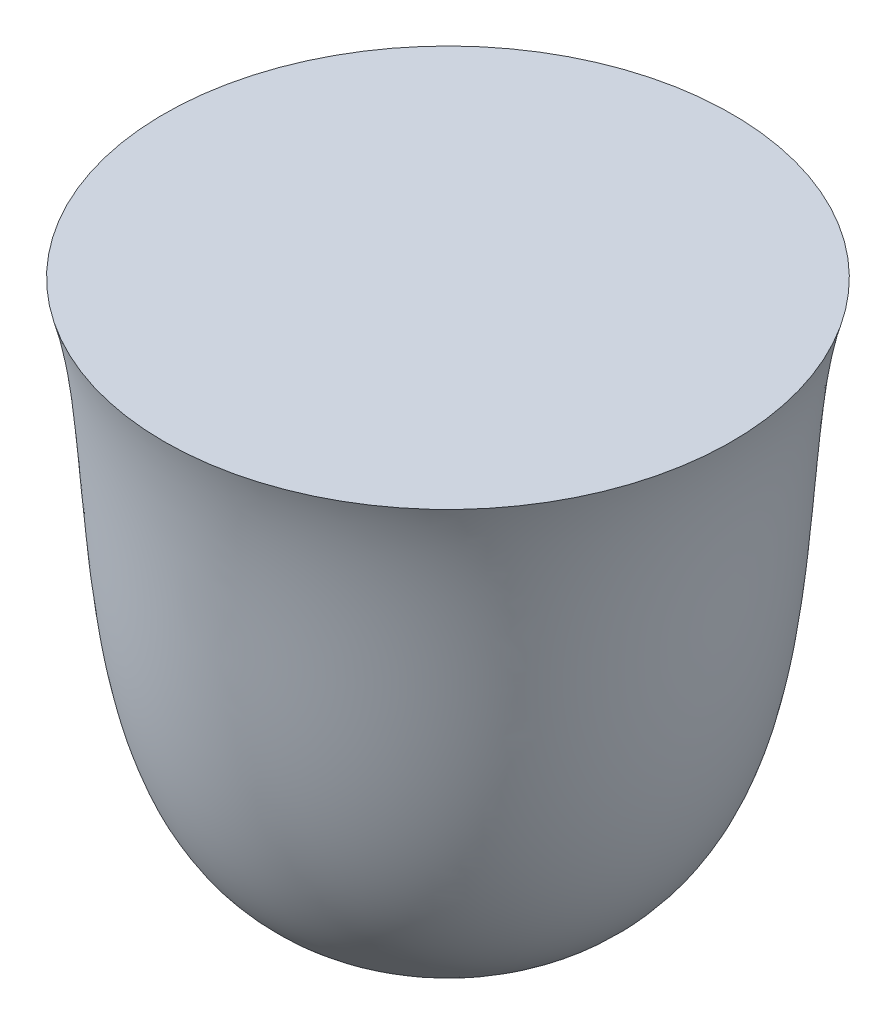
ISO-10303-21;
HEADER;
FILE_DESCRIPTION(('STEP AP214'),'2;1');
FILE_NAME('part.step','',(''),(''),'','','');
FILE_SCHEMA(('AUTOMOTIVE_DESIGN { 1 0 10303 214 1 1 1 1 }'));
ENDSEC;
DATA;
#1=APPLICATION_CONTEXT('core data for automotive mechanical design processes');
#2=APPLICATION_PROTOCOL_DEFINITION('international standard','automotive_design',2000,#1);
#3=PRODUCT_CONTEXT('',#1,'mechanical');
#4=PRODUCT('Part','Part','',(#3));
#5=PRODUCT_RELATED_PRODUCT_CATEGORY('part','',(#4));
#6=PRODUCT_DEFINITION_FORMATION('','',#4);
#7=PRODUCT_DEFINITION_CONTEXT('part definition',#1,'design');
#8=PRODUCT_DEFINITION('design','',#6,#7);
#9=PRODUCT_DEFINITION_SHAPE('','',#8);
#10=(LENGTH_UNIT() NAMED_UNIT(*) SI_UNIT(.MILLI.,.METRE.));
#11=(NAMED_UNIT(*) PLANE_ANGLE_UNIT() SI_UNIT($,.RADIAN.));
#12=(NAMED_UNIT(*) SI_UNIT($,.STERADIAN.) SOLID_ANGLE_UNIT());
#13=UNCERTAINTY_MEASURE_WITH_UNIT(LENGTH_MEASURE(1.E-05),#10,'distance_accuracy_value','');
#14=(GEOMETRIC_REPRESENTATION_CONTEXT(3) GLOBAL_UNCERTAINTY_ASSIGNED_CONTEXT((#13)) GLOBAL_UNIT_ASSIGNED_CONTEXT((#10,
#11,#12)) REPRESENTATION_CONTEXT('',''));
#15=CARTESIAN_POINT('',(0.,0.,0.));
#16=DIRECTION('',(0.,0.,1.));
#17=DIRECTION('',(1.,0.,0.));
#18=AXIS2_PLACEMENT_3D('',#15,#16,#17);
#19=CARTESIAN_POINT('',(3.36313477959784,-150.,0.));
#20=DIRECTION('',(0.,1.,0.));
#21=DIRECTION('',(0.,0.,1.));
#22=AXIS2_PLACEMENT_3D('',#19,#20,#21);
#23=PLANE('',#22);
#24=CARTESIAN_POINT('',(0.,-150.,0.));
#25=DIRECTION('',(0.,1.,0.));
#26=DIRECTION('',(0.,0.,1.));
#27=AXIS2_PLACEMENT_3D('',#24,#25,#26);
#28=CIRCLE('',#27,3.36313477959784);
#29=CARTESIAN_POINT('',(0.,-150.,3.36313477959784));
#30=VERTEX_POINT('',#29);
#31=EDGE_CURVE('E10',#30,#30,#28,.T.);
#32=ORIENTED_EDGE('',*,*,#31,.F.);
#33=EDGE_LOOP('',(#32));
#34=FACE_BOUND('',#33,.T.);
#35=ADVANCED_FACE('F43',(#34),#23,.F.);
#36=CARTESIAN_POINT('',(0.,-146.,0.));
#37=DIRECTION('',(0.,1.,0.));
#38=DIRECTION('',(0.,0.,1.));
#39=AXIS2_PLACEMENT_3D('',#36,#37,#38);
#40=DEGENERATE_TOROIDAL_SURFACE('',#39,3.36313477959787,4.,.T.);
#41=CARTESIAN_POINT('',(0.,-146.,0.));
#42=DIRECTION('',(0.,1.,0.));
#43=DIRECTION('',(0.,0.,1.));
#44=AXIS2_PLACEMENT_3D('',#41,#42,#43);
#45=CIRCLE('',#44,7.36313477959787);
#46=CARTESIAN_POINT('',(0.,-146.,7.36313477959787));
#47=VERTEX_POINT('',#46);
#48=EDGE_CURVE('E50',#47,#47,#45,.T.);
#49=ORIENTED_EDGE('',*,*,#48,.F.);
#50=EDGE_LOOP('',(#49));
#51=FACE_BOUND('',#50,.T.);
#52=ORIENTED_EDGE('',*,*,#31,.T.);
#53=EDGE_LOOP('',(#52));
#54=FACE_BOUND('',#53,.T.);
#55=ADVANCED_FACE('F89',(#51,#54),#40,.T.);
#56=CARTESIAN_POINT('',(0.,0.,0.));
#57=DIRECTION('',(0.,1.,0.));
#58=DIRECTION('',(0.,0.,1.));
#59=AXIS2_PLACEMENT_3D('',#56,#57,#58);
#60=CYLINDRICAL_SURFACE('',#59,7.36313477959786);
#61=CARTESIAN_POINT('',(0.,-145.863134177577,0.));
#62=DIRECTION('',(0.,1.,0.));
#63=DIRECTION('',(0.,0.,1.));
#64=AXIS2_PLACEMENT_3D('',#61,#62,#63);
#65=CIRCLE('',#64,7.36313477959786);
#66=CARTESIAN_POINT('',(0.,-145.863134177577,7.36313477959786));
#67=VERTEX_POINT('',#66);
#68=EDGE_CURVE('E55',#67,#67,#65,.T.);
#69=ORIENTED_EDGE('',*,*,#68,.F.);
#70=EDGE_LOOP('',(#69));
#71=FACE_BOUND('',#70,.T.);
#72=ORIENTED_EDGE('',*,*,#48,.T.);
#73=EDGE_LOOP('',(#72));
#74=FACE_BOUND('',#73,.T.);
#75=ADVANCED_FACE('F86',(#71,#74),#60,.T.);
#76=CARTESIAN_POINT('',(0.,-145.863134177577,0.));
#77=DIRECTION('',(0.,1.,0.));
#78=DIRECTION('',(0.,0.,1.));
#79=AXIS2_PLACEMENT_3D('',#76,#77,#78);
#80=TOROIDAL_SURFACE('',#79,11.3631347795979,4.00000000000001);
#81=CARTESIAN_POINT('',(0.,-141.870118166623,0.));
#82=DIRECTION('',(0.,1.,0.));
#83=DIRECTION('',(0.,0.,1.));
#84=AXIS2_PLACEMENT_3D('',#81,#82,#83);
#85=CIRCLE('',#84,11.126865576638);
#86=CARTESIAN_POINT('',(0.,-141.870118166623,11.126865576638));
#87=VERTEX_POINT('',#86);
#88=EDGE_CURVE('E60',#87,#87,#85,.T.);
#89=ORIENTED_EDGE('',*,*,#88,.F.);
#90=EDGE_LOOP('',(#89));
#91=FACE_BOUND('',#90,.T.);
#92=ORIENTED_EDGE('',*,*,#68,.T.);
#93=EDGE_LOOP('',(#92));
#94=FACE_BOUND('',#93,.T.);
#95=ADVANCED_FACE('F82',(#91,#94),#80,.F.);
#96=CARTESIAN_POINT('',(11.126865576638,-141.870118166623,0.));
#97=CARTESIAN_POINT('',(26.0387906955035,-140.987770424273,0.));
#98=CARTESIAN_POINT('',(76.3506216716413,-116.580239954759,0.));
#99=CARTESIAN_POINT('',(64.4106802443803,-34.5071204698522,0.));
#100=CARTESIAN_POINT('',(75.,0.,0.));
#101=B_SPLINE_CURVE_WITH_KNOTS('',3,(#96,#97,#98,#99,#100),.UNSPECIFIED.,.F.,.F.,(4,1,4),
(0.0176675941788211,0.232438422931567,1.),.UNSPECIFIED.);
#102=CARTESIAN_POINT('',(0.,0.,0.));
#103=DIRECTION('',(0.,1.,0.));
#104=AXIS1_PLACEMENT('',#102,#103);
#105=SURFACE_OF_REVOLUTION('',#101,#104);
#106=CARTESIAN_POINT('',(0.,0.,0.));
#107=DIRECTION('',(0.,1.,0.));
#108=DIRECTION('',(0.,0.,1.));
#109=AXIS2_PLACEMENT_3D('',#106,#107,#108);
#110=CIRCLE('',#109,75.);
#111=CARTESIAN_POINT('',(0.,0.,75.));
#112=VERTEX_POINT('',#111);
#113=EDGE_CURVE('E66',#112,#112,#110,.T.);
#114=ORIENTED_EDGE('',*,*,#113,.F.);
#115=EDGE_LOOP('',(#114));
#116=FACE_BOUND('',#115,.T.);
#117=ORIENTED_EDGE('',*,*,#88,.T.);
#118=EDGE_LOOP('',(#117));
#119=FACE_BOUND('',#118,.T.);
#120=ADVANCED_FACE('F77',(#116,#119),#105,.T.);
#121=CARTESIAN_POINT('',(0.,0.,0.));
#122=DIRECTION('',(0.,-1.,0.));
#123=DIRECTION('',(0.,0.,-1.));
#124=AXIS2_PLACEMENT_3D('',#121,#122,#123);
#125=PLANE('',#124);
#126=ORIENTED_EDGE('',*,*,#113,.T.);
#127=EDGE_LOOP('',(#126));
#128=FACE_BOUND('',#127,.T.);
#129=ADVANCED_FACE('F81',(#128),#125,.F.);
#130=CLOSED_SHELL('',(#35,#55,#75,#95,#120,#129));
#131=MANIFOLD_SOLID_BREP('B2',#130);
#132=ADVANCED_BREP_SHAPE_REPRESENTATION('',(#18,#131),#14);
#133=SHAPE_DEFINITION_REPRESENTATION(#9,#132);
ENDSEC;
END-ISO-10303-21;
